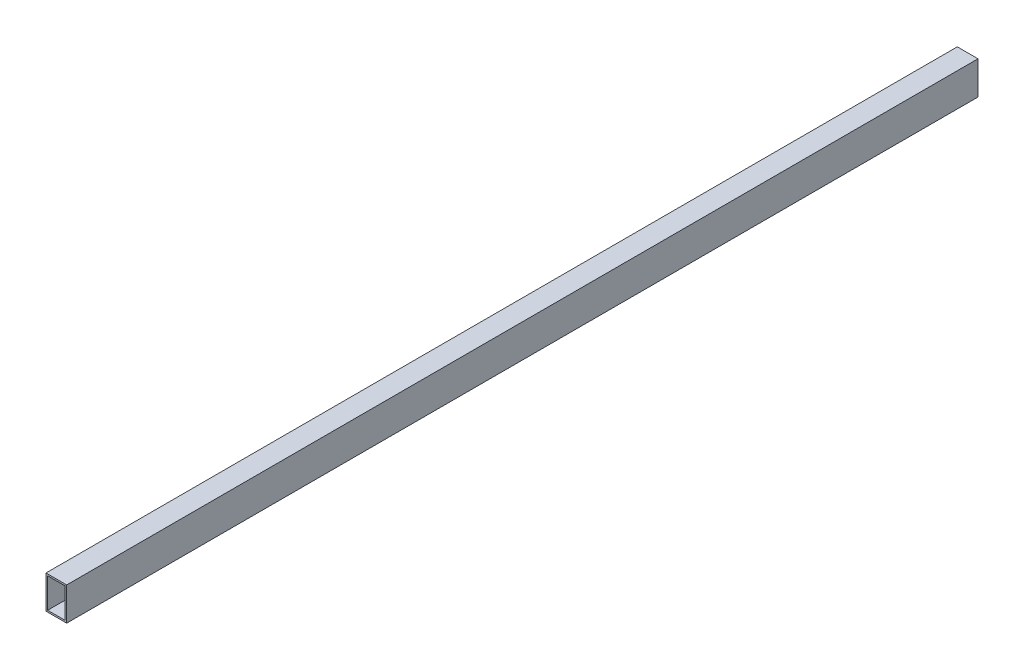
ISO-10303-21;
HEADER;
FILE_DESCRIPTION(('STEP AP214'),'2;1');
FILE_NAME('part.step','',(''),(''),'','','');
FILE_SCHEMA(('AUTOMOTIVE_DESIGN { 1 0 10303 214 1 1 1 1 }'));
ENDSEC;
DATA;
#1=APPLICATION_CONTEXT('core data for automotive mechanical design processes');
#2=APPLICATION_PROTOCOL_DEFINITION('international standard','automotive_design',2000,#1);
#3=PRODUCT_CONTEXT('',#1,'mechanical');
#4=PRODUCT('Part','Part','',(#3));
#5=PRODUCT_RELATED_PRODUCT_CATEGORY('part','',(#4));
#6=PRODUCT_DEFINITION_FORMATION('','',#4);
#7=PRODUCT_DEFINITION_CONTEXT('part definition',#1,'design');
#8=PRODUCT_DEFINITION('design','',#6,#7);
#9=PRODUCT_DEFINITION_SHAPE('','',#8);
#10=(LENGTH_UNIT() NAMED_UNIT(*) SI_UNIT(.MILLI.,.METRE.));
#11=(NAMED_UNIT(*) PLANE_ANGLE_UNIT() SI_UNIT($,.RADIAN.));
#12=(NAMED_UNIT(*) SI_UNIT($,.STERADIAN.) SOLID_ANGLE_UNIT());
#13=UNCERTAINTY_MEASURE_WITH_UNIT(LENGTH_MEASURE(1.E-05),#10,'distance_accuracy_value','');
#14=(GEOMETRIC_REPRESENTATION_CONTEXT(3) GLOBAL_UNCERTAINTY_ASSIGNED_CONTEXT((#13)) GLOBAL_UNIT_ASSIGNED_CONTEXT((#10,
#11,#12)) REPRESENTATION_CONTEXT('',''));
#15=CARTESIAN_POINT('',(0.,0.,0.));
#16=DIRECTION('',(0.,0.,1.));
#17=DIRECTION('',(1.,0.,0.));
#18=AXIS2_PLACEMENT_3D('',#15,#16,#17);
#19=CARTESIAN_POINT('',(-25.,40.,2200.));
#20=DIRECTION('',(1.,0.,0.));
#21=DIRECTION('',(0.,1.,0.));
#22=AXIS2_PLACEMENT_3D('',#19,#20,#21);
#23=PLANE('',#22);
#24=DIRECTION('',(0.,-1.,0.));
#25=VECTOR('',#24,1.);
#26=CARTESIAN_POINT('',(-25.,40.,0.));
#27=LINE('',#26,#25);
#28=CARTESIAN_POINT('',(-25.,40.,0.));
#29=VERTEX_POINT('',#28);
#30=CARTESIAN_POINT('',(-25.,-40.,0.));
#31=VERTEX_POINT('',#30);
#32=EDGE_CURVE('E147',#29,#31,#27,.T.);
#33=ORIENTED_EDGE('',*,*,#32,.T.);
#34=DIRECTION('',(0.,0.,-1.));
#35=VECTOR('',#34,1.);
#36=CARTESIAN_POINT('',(-25.,-40.,2200.));
#37=LINE('',#36,#35);
#38=CARTESIAN_POINT('',(-25.,-40.,2200.));
#39=VERTEX_POINT('',#38);
#40=EDGE_CURVE('E11',#39,#31,#37,.T.);
#41=ORIENTED_EDGE('',*,*,#40,.F.);
#42=DIRECTION('',(0.,-1.,0.));
#43=VECTOR('',#42,1.);
#44=CARTESIAN_POINT('',(-25.,40.,2200.));
#45=LINE('',#44,#43);
#46=CARTESIAN_POINT('',(-25.,40.,2200.));
#47=VERTEX_POINT('',#46);
#48=EDGE_CURVE('E153',#47,#39,#45,.T.);
#49=ORIENTED_EDGE('',*,*,#48,.F.);
#50=DIRECTION('',(0.,0.,-1.));
#51=VECTOR('',#50,1.);
#52=CARTESIAN_POINT('',(-25.,40.,2200.));
#53=LINE('',#52,#51);
#54=EDGE_CURVE('E169',#47,#29,#53,.T.);
#55=ORIENTED_EDGE('',*,*,#54,.T.);
#56=EDGE_LOOP('',(#33,#41,#49,#55));
#57=FACE_BOUND('',#56,.T.);
#58=ADVANCED_FACE('F39',(#57),#23,.F.);
#59=CARTESIAN_POINT('',(-25.,-40.,2200.));
#60=DIRECTION('',(0.,1.,0.));
#61=DIRECTION('',(0.,0.,1.));
#62=AXIS2_PLACEMENT_3D('',#59,#60,#61);
#63=PLANE('',#62);
#64=DIRECTION('',(1.,0.,0.));
#65=VECTOR('',#64,1.);
#66=CARTESIAN_POINT('',(-25.,-40.,0.));
#67=LINE('',#66,#65);
#68=CARTESIAN_POINT('',(25.,-40.,0.));
#69=VERTEX_POINT('',#68);
#70=EDGE_CURVE('E173',#31,#69,#67,.T.);
#71=ORIENTED_EDGE('',*,*,#70,.T.);
#72=DIRECTION('',(0.,0.,-1.));
#73=VECTOR('',#72,1.);
#74=CARTESIAN_POINT('',(25.,-40.,2200.));
#75=LINE('',#74,#73);
#76=CARTESIAN_POINT('',(25.,-40.,2200.));
#77=VERTEX_POINT('',#76);
#78=EDGE_CURVE('E47',#77,#69,#75,.T.);
#79=ORIENTED_EDGE('',*,*,#78,.F.);
#80=DIRECTION('',(1.,0.,0.));
#81=VECTOR('',#80,1.);
#82=CARTESIAN_POINT('',(-25.,-40.,2200.));
#83=LINE('',#82,#81);
#84=EDGE_CURVE('E157',#39,#77,#83,.T.);
#85=ORIENTED_EDGE('',*,*,#84,.F.);
#86=ORIENTED_EDGE('',*,*,#40,.T.);
#87=EDGE_LOOP('',(#71,#79,#85,#86));
#88=FACE_BOUND('',#87,.T.);
#89=ADVANCED_FACE('F195',(#88),#63,.F.);
#90=CARTESIAN_POINT('',(25.,40.,2200.));
#91=DIRECTION('',(1.,0.,0.));
#92=DIRECTION('',(0.,0.,-1.));
#93=AXIS2_PLACEMENT_3D('',#90,#91,#92);
#94=PLANE('',#93);
#95=DIRECTION('',(0.,-1.,0.));
#96=VECTOR('',#95,1.);
#97=CARTESIAN_POINT('',(25.,40.,0.));
#98=LINE('',#97,#96);
#99=CARTESIAN_POINT('',(25.,40.,0.));
#100=VERTEX_POINT('',#99);
#101=EDGE_CURVE('E177',#100,#69,#98,.T.);
#102=ORIENTED_EDGE('',*,*,#101,.F.);
#103=DIRECTION('',(0.,0.,-1.));
#104=VECTOR('',#103,1.);
#105=CARTESIAN_POINT('',(25.,40.,2200.));
#106=LINE('',#105,#104);
#107=CARTESIAN_POINT('',(25.,40.,2200.));
#108=VERTEX_POINT('',#107);
#109=EDGE_CURVE('E186',#108,#100,#106,.T.);
#110=ORIENTED_EDGE('',*,*,#109,.F.);
#111=DIRECTION('',(0.,-1.,0.));
#112=VECTOR('',#111,1.);
#113=CARTESIAN_POINT('',(25.,40.,2200.));
#114=LINE('',#113,#112);
#115=EDGE_CURVE('E161',#108,#77,#114,.T.);
#116=ORIENTED_EDGE('',*,*,#115,.T.);
#117=ORIENTED_EDGE('',*,*,#78,.T.);
#118=EDGE_LOOP('',(#102,#110,#116,#117));
#119=FACE_BOUND('',#118,.T.);
#120=ADVANCED_FACE('F192',(#119),#94,.T.);
#121=CARTESIAN_POINT('',(-25.,40.,2200.));
#122=DIRECTION('',(0.,1.,0.));
#123=DIRECTION('',(0.,0.,1.));
#124=AXIS2_PLACEMENT_3D('',#121,#122,#123);
#125=PLANE('',#124);
#126=DIRECTION('',(1.,0.,0.));
#127=VECTOR('',#126,1.);
#128=CARTESIAN_POINT('',(-25.,40.,0.));
#129=LINE('',#128,#127);
#130=EDGE_CURVE('E158',#29,#100,#129,.T.);
#131=ORIENTED_EDGE('',*,*,#130,.F.);
#132=ORIENTED_EDGE('',*,*,#54,.F.);
#133=DIRECTION('',(1.,0.,0.));
#134=VECTOR('',#133,1.);
#135=CARTESIAN_POINT('',(-25.,40.,2200.));
#136=LINE('',#135,#134);
#137=EDGE_CURVE('E165',#47,#108,#136,.T.);
#138=ORIENTED_EDGE('',*,*,#137,.T.);
#139=ORIENTED_EDGE('',*,*,#109,.T.);
#140=EDGE_LOOP('',(#131,#132,#138,#139));
#141=FACE_BOUND('',#140,.T.);
#142=ADVANCED_FACE('F202',(#141),#125,.T.);
#143=CARTESIAN_POINT('',(0.,0.,2200.));
#144=DIRECTION('',(0.,0.,1.));
#145=DIRECTION('',(1.,0.,0.));
#146=AXIS2_PLACEMENT_3D('',#143,#144,#145);
#147=PLANE('',#146);
#148=DIRECTION('',(0.,1.,0.));
#149=VECTOR('',#148,1.);
#150=CARTESIAN_POINT('',(-21.,36.,2200.));
#151=LINE('',#150,#149);
#152=CARTESIAN_POINT('',(-21.,-36.,2200.));
#153=VERTEX_POINT('',#152);
#154=CARTESIAN_POINT('',(-21.,36.,2200.));
#155=VERTEX_POINT('',#154);
#156=EDGE_CURVE('E106',#153,#155,#151,.T.);
#157=ORIENTED_EDGE('',*,*,#156,.T.);
#158=DIRECTION('',(1.,0.,0.));
#159=VECTOR('',#158,1.);
#160=CARTESIAN_POINT('',(21.,36.,2200.));
#161=LINE('',#160,#159);
#162=CARTESIAN_POINT('',(21.,36.,2200.));
#163=VERTEX_POINT('',#162);
#164=EDGE_CURVE('E116',#155,#163,#161,.T.);
#165=ORIENTED_EDGE('',*,*,#164,.T.);
#166=DIRECTION('',(0.,-1.,0.));
#167=VECTOR('',#166,1.);
#168=CARTESIAN_POINT('',(21.,36.,2200.));
#169=LINE('',#168,#167);
#170=CARTESIAN_POINT('',(21.,-36.,2200.));
#171=VERTEX_POINT('',#170);
#172=EDGE_CURVE('E54',#163,#171,#169,.T.);
#173=ORIENTED_EDGE('',*,*,#172,.T.);
#174=DIRECTION('',(-1.,0.,0.));
#175=VECTOR('',#174,1.);
#176=CARTESIAN_POINT('',(21.,-36.,2200.));
#177=LINE('',#176,#175);
#178=EDGE_CURVE('E113',#171,#153,#177,.T.);
#179=ORIENTED_EDGE('',*,*,#178,.T.);
#180=EDGE_LOOP('',(#157,#165,#173,#179));
#181=FACE_BOUND('',#180,.T.);
#182=ORIENTED_EDGE('',*,*,#48,.T.);
#183=ORIENTED_EDGE('',*,*,#84,.T.);
#184=ORIENTED_EDGE('',*,*,#115,.F.);
#185=ORIENTED_EDGE('',*,*,#137,.F.);
#186=EDGE_LOOP('',(#182,#183,#184,#185));
#187=FACE_BOUND('',#186,.T.);
#188=ADVANCED_FACE('F121',(#181,#187),#147,.T.);
#189=CARTESIAN_POINT('',(0.,0.,0.));
#190=DIRECTION('',(0.,0.,1.));
#191=DIRECTION('',(1.,0.,0.));
#192=AXIS2_PLACEMENT_3D('',#189,#190,#191);
#193=PLANE('',#192);
#194=DIRECTION('',(1.,0.,0.));
#195=VECTOR('',#194,1.);
#196=CARTESIAN_POINT('',(21.,36.,0.));
#197=LINE('',#196,#195);
#198=CARTESIAN_POINT('',(-21.,36.,0.));
#199=VERTEX_POINT('',#198);
#200=CARTESIAN_POINT('',(21.,36.,0.));
#201=VERTEX_POINT('',#200);
#202=EDGE_CURVE('E138',#199,#201,#197,.T.);
#203=ORIENTED_EDGE('',*,*,#202,.F.);
#204=DIRECTION('',(0.,1.,0.));
#205=VECTOR('',#204,1.);
#206=CARTESIAN_POINT('',(-21.,36.,0.));
#207=LINE('',#206,#205);
#208=CARTESIAN_POINT('',(-21.,-36.,0.));
#209=VERTEX_POINT('',#208);
#210=EDGE_CURVE('E62',#209,#199,#207,.T.);
#211=ORIENTED_EDGE('',*,*,#210,.F.);
#212=DIRECTION('',(-1.,0.,0.));
#213=VECTOR('',#212,1.);
#214=CARTESIAN_POINT('',(21.,-36.,0.));
#215=LINE('',#214,#213);
#216=CARTESIAN_POINT('',(21.,-36.,0.));
#217=VERTEX_POINT('',#216);
#218=EDGE_CURVE('E125',#217,#209,#215,.T.);
#219=ORIENTED_EDGE('',*,*,#218,.F.);
#220=DIRECTION('',(0.,-1.,0.));
#221=VECTOR('',#220,1.);
#222=CARTESIAN_POINT('',(21.,36.,0.));
#223=LINE('',#222,#221);
#224=EDGE_CURVE('E129',#201,#217,#223,.T.);
#225=ORIENTED_EDGE('',*,*,#224,.F.);
#226=EDGE_LOOP('',(#203,#211,#219,#225));
#227=FACE_BOUND('',#226,.T.);
#228=ORIENTED_EDGE('',*,*,#32,.F.);
#229=ORIENTED_EDGE('',*,*,#130,.T.);
#230=ORIENTED_EDGE('',*,*,#101,.T.);
#231=ORIENTED_EDGE('',*,*,#70,.F.);
#232=EDGE_LOOP('',(#228,#229,#230,#231));
#233=FACE_BOUND('',#232,.T.);
#234=ADVANCED_FACE('F199',(#227,#233),#193,.F.);
#235=CARTESIAN_POINT('',(-21.,36.,2200.));
#236=DIRECTION('',(-1.,0.,0.));
#237=DIRECTION('',(0.,-1.,0.));
#238=AXIS2_PLACEMENT_3D('',#235,#236,#237);
#239=PLANE('',#238);
#240=ORIENTED_EDGE('',*,*,#210,.T.);
#241=DIRECTION('',(0.,0.,-1.));
#242=VECTOR('',#241,1.);
#243=CARTESIAN_POINT('',(-21.,36.,2200.));
#244=LINE('',#243,#242);
#245=EDGE_CURVE('E102',#155,#199,#244,.T.);
#246=ORIENTED_EDGE('',*,*,#245,.F.);
#247=ORIENTED_EDGE('',*,*,#156,.F.);
#248=DIRECTION('',(0.,0.,-1.));
#249=VECTOR('',#248,1.);
#250=CARTESIAN_POINT('',(-21.,-36.,2200.));
#251=LINE('',#250,#249);
#252=EDGE_CURVE('E144',#153,#209,#251,.T.);
#253=ORIENTED_EDGE('',*,*,#252,.T.);
#254=EDGE_LOOP('',(#240,#246,#247,#253));
#255=FACE_BOUND('',#254,.T.);
#256=ADVANCED_FACE('F104',(#255),#239,.F.);
#257=CARTESIAN_POINT('',(21.,-36.,2200.));
#258=DIRECTION('',(0.,-1.,0.));
#259=DIRECTION('',(0.,0.,-1.));
#260=AXIS2_PLACEMENT_3D('',#257,#258,#259);
#261=PLANE('',#260);
#262=ORIENTED_EDGE('',*,*,#218,.T.);
#263=ORIENTED_EDGE('',*,*,#252,.F.);
#264=ORIENTED_EDGE('',*,*,#178,.F.);
#265=DIRECTION('',(0.,0.,-1.));
#266=VECTOR('',#265,1.);
#267=CARTESIAN_POINT('',(21.,-36.,2200.));
#268=LINE('',#267,#266);
#269=EDGE_CURVE('E148',#171,#217,#268,.T.);
#270=ORIENTED_EDGE('',*,*,#269,.T.);
#271=EDGE_LOOP('',(#262,#263,#264,#270));
#272=FACE_BOUND('',#271,.T.);
#273=ADVANCED_FACE('F224',(#272),#261,.F.);
#274=CARTESIAN_POINT('',(21.,36.,2200.));
#275=DIRECTION('',(1.,0.,0.));
#276=DIRECTION('',(0.,1.,0.));
#277=AXIS2_PLACEMENT_3D('',#274,#275,#276);
#278=PLANE('',#277);
#279=ORIENTED_EDGE('',*,*,#224,.T.);
#280=ORIENTED_EDGE('',*,*,#269,.F.);
#281=ORIENTED_EDGE('',*,*,#172,.F.);
#282=DIRECTION('',(0.,0.,-1.));
#283=VECTOR('',#282,1.);
#284=CARTESIAN_POINT('',(21.,36.,2200.));
#285=LINE('',#284,#283);
#286=EDGE_CURVE('E112',#163,#201,#285,.T.);
#287=ORIENTED_EDGE('',*,*,#286,.T.);
#288=EDGE_LOOP('',(#279,#280,#281,#287));
#289=FACE_BOUND('',#288,.T.);
#290=ADVANCED_FACE('F227',(#289),#278,.F.);
#291=CARTESIAN_POINT('',(21.,36.,2200.));
#292=DIRECTION('',(0.,1.,0.));
#293=DIRECTION('',(0.,0.,1.));
#294=AXIS2_PLACEMENT_3D('',#291,#292,#293);
#295=PLANE('',#294);
#296=ORIENTED_EDGE('',*,*,#202,.T.);
#297=ORIENTED_EDGE('',*,*,#286,.F.);
#298=ORIENTED_EDGE('',*,*,#164,.F.);
#299=ORIENTED_EDGE('',*,*,#245,.T.);
#300=EDGE_LOOP('',(#296,#297,#298,#299));
#301=FACE_BOUND('',#300,.T.);
#302=ADVANCED_FACE('F117',(#301),#295,.F.);
#303=CLOSED_SHELL('',(#58,#89,#120,#142,#188,#234,#256,#273,#290,#302));
#304=MANIFOLD_SOLID_BREP('B2',#303);
#305=ADVANCED_BREP_SHAPE_REPRESENTATION('',(#18,#304),#14);
#306=SHAPE_DEFINITION_REPRESENTATION(#9,#305);
ENDSEC;
END-ISO-10303-21;
